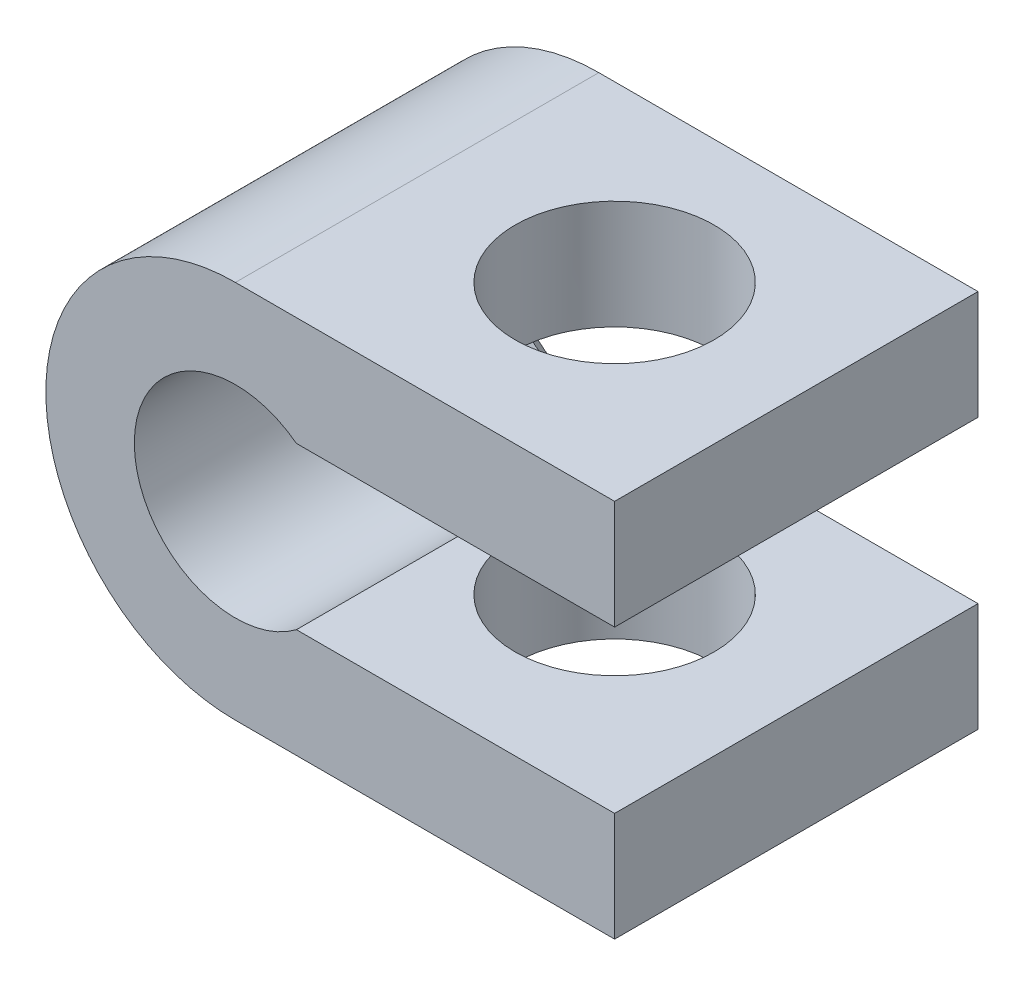
ISO-10303-21;
HEADER;
FILE_DESCRIPTION(('STEP AP214'),'2;1');
FILE_NAME('part.step','',(''),(''),'','','');
FILE_SCHEMA(('AUTOMOTIVE_DESIGN { 1 0 10303 214 1 1 1 1 }'));
ENDSEC;
DATA;
#1=APPLICATION_CONTEXT('core data for automotive mechanical design processes');
#2=APPLICATION_PROTOCOL_DEFINITION('international standard','automotive_design',2000,#1);
#3=PRODUCT_CONTEXT('',#1,'mechanical');
#4=PRODUCT('Part','Part','',(#3));
#5=PRODUCT_RELATED_PRODUCT_CATEGORY('part','',(#4));
#6=PRODUCT_DEFINITION_FORMATION('','',#4);
#7=PRODUCT_DEFINITION_CONTEXT('part definition',#1,'design');
#8=PRODUCT_DEFINITION('design','',#6,#7);
#9=PRODUCT_DEFINITION_SHAPE('','',#8);
#10=(LENGTH_UNIT() NAMED_UNIT(*) SI_UNIT(.MILLI.,.METRE.));
#11=(NAMED_UNIT(*) PLANE_ANGLE_UNIT() SI_UNIT($,.RADIAN.));
#12=(NAMED_UNIT(*) SI_UNIT($,.STERADIAN.) SOLID_ANGLE_UNIT());
#13=UNCERTAINTY_MEASURE_WITH_UNIT(LENGTH_MEASURE(1.E-05),#10,'distance_accuracy_value','');
#14=(GEOMETRIC_REPRESENTATION_CONTEXT(3) GLOBAL_UNCERTAINTY_ASSIGNED_CONTEXT((#13)) GLOBAL_UNIT_ASSIGNED_CONTEXT((#10,
#11,#12)) REPRESENTATION_CONTEXT('',''));
#15=CARTESIAN_POINT('',(0.,0.,0.));
#16=DIRECTION('',(0.,0.,1.));
#17=DIRECTION('',(1.,0.,0.));
#18=AXIS2_PLACEMENT_3D('',#15,#16,#17);
#19=CARTESIAN_POINT('',(0.,0.,12.));
#20=DIRECTION('',(0.,0.,-1.));
#21=DIRECTION('',(-1.,0.,0.));
#22=AXIS2_PLACEMENT_3D('',#19,#20,#21);
#23=CYLINDRICAL_SURFACE('',#22,3.2);
#24=DIRECTION('',(0.,0.,-1.));
#25=VECTOR('',#24,1.);
#26=CARTESIAN_POINT('',(1.92968099110157,-2.55271057360235,12.));
#27=LINE('',#26,#25);
#28=CARTESIAN_POINT('',(1.92968099110157,-2.55271057360235,12.));
#29=VERTEX_POINT('',#28);
#30=CARTESIAN_POINT('',(1.92968099110157,-2.55271057360235,0.5));
#31=VERTEX_POINT('',#30);
#32=EDGE_CURVE('E294',#29,#31,#27,.T.);
#33=ORIENTED_EDGE('',*,*,#32,.T.);
#34=CARTESIAN_POINT('',(0.,0.,0.5));
#35=DIRECTION('',(0.,0.,1.));
#36=DIRECTION('',(1.,0.,0.));
#37=AXIS2_PLACEMENT_3D('',#34,#35,#36);
#38=CIRCLE('',#37,3.2);
#39=CARTESIAN_POINT('',(1.92968099110157,2.55271057360235,0.5));
#40=VERTEX_POINT('',#39);
#41=EDGE_CURVE('E43',#31,#40,#38,.F.);
#42=ORIENTED_EDGE('',*,*,#41,.T.);
#43=DIRECTION('',(0.,0.,-1.));
#44=VECTOR('',#43,1.);
#45=CARTESIAN_POINT('',(1.92968099110157,2.55271057360235,12.));
#46=LINE('',#45,#44);
#47=CARTESIAN_POINT('',(1.92968099110157,2.55271057360235,12.));
#48=VERTEX_POINT('',#47);
#49=EDGE_CURVE('E128',#48,#40,#46,.T.);
#50=ORIENTED_EDGE('',*,*,#49,.F.);
#51=CARTESIAN_POINT('',(0.,0.,12.));
#52=DIRECTION('',(0.,0.,-1.));
#53=DIRECTION('',(1.,0.,0.));
#54=AXIS2_PLACEMENT_3D('',#51,#52,#53);
#55=CIRCLE('',#54,3.2);
#56=EDGE_CURVE('E135',#29,#48,#55,.T.);
#57=ORIENTED_EDGE('',*,*,#56,.F.);
#58=EDGE_LOOP('',(#33,#42,#50,#57));
#59=FACE_BOUND('',#58,.T.);
#60=ADVANCED_FACE('F34',(#59),#23,.F.);
#61=CARTESIAN_POINT('',(12.,2.55271057360235,12.));
#62=DIRECTION('',(0.,1.,0.));
#63=DIRECTION('',(-1.,0.,0.));
#64=AXIS2_PLACEMENT_3D('',#61,#62,#63);
#65=PLANE('',#64);
#66=CARTESIAN_POINT('',(6.,2.55271057360235,6.));
#67=DIRECTION('',(0.,1.,0.));
#68=DIRECTION('',(-1.,0.,0.));
#69=AXIS2_PLACEMENT_3D('',#66,#67,#68);
#70=CIRCLE('',#69,3.15);
#71=CARTESIAN_POINT('',(2.85,2.55271057360235,6.));
#72=VERTEX_POINT('',#71);
#73=EDGE_CURVE('E141',#72,#72,#70,.T.);
#74=ORIENTED_EDGE('',*,*,#73,.T.);
#75=EDGE_LOOP('',(#74));
#76=FACE_BOUND('',#75,.T.);
#77=ORIENTED_EDGE('',*,*,#49,.T.);
#78=DIRECTION('',(1.,0.,0.));
#79=VECTOR('',#78,1.);
#80=CARTESIAN_POINT('',(12.,2.55271057360235,0.5));
#81=LINE('',#80,#79);
#82=CARTESIAN_POINT('',(12.,2.55271057360235,0.5));
#83=VERTEX_POINT('',#82);
#84=EDGE_CURVE('E11',#40,#83,#81,.T.);
#85=ORIENTED_EDGE('',*,*,#84,.T.);
#86=DIRECTION('',(0.,0.,-1.));
#87=VECTOR('',#86,1.);
#88=CARTESIAN_POINT('',(12.,2.55271057360235,12.));
#89=LINE('',#88,#87);
#90=CARTESIAN_POINT('',(12.,2.55271057360235,12.));
#91=VERTEX_POINT('',#90);
#92=EDGE_CURVE('E131',#91,#83,#89,.T.);
#93=ORIENTED_EDGE('',*,*,#92,.F.);
#94=DIRECTION('',(1.,0.,0.));
#95=VECTOR('',#94,1.);
#96=CARTESIAN_POINT('',(12.,2.55271057360235,12.));
#97=LINE('',#96,#95);
#98=EDGE_CURVE('E125',#48,#91,#97,.T.);
#99=ORIENTED_EDGE('',*,*,#98,.F.);
#100=EDGE_LOOP('',(#77,#85,#93,#99));
#101=FACE_BOUND('',#100,.T.);
#102=ADVANCED_FACE('F127',(#76,#101),#65,.F.);
#103=CARTESIAN_POINT('',(12.,6.,12.));
#104=DIRECTION('',(-1.,0.,0.));
#105=DIRECTION('',(0.,0.,1.));
#106=AXIS2_PLACEMENT_3D('',#103,#104,#105);
#107=PLANE('',#106);
#108=ORIENTED_EDGE('',*,*,#92,.T.);
#109=DIRECTION('',(0.,1.,0.));
#110=VECTOR('',#109,1.);
#111=CARTESIAN_POINT('',(12.,6.,0.5));
#112=LINE('',#111,#110);
#113=CARTESIAN_POINT('',(12.,6.,0.5));
#114=VERTEX_POINT('',#113);
#115=EDGE_CURVE('E178',#83,#114,#112,.T.);
#116=ORIENTED_EDGE('',*,*,#115,.T.);
#117=DIRECTION('',(0.,0.,-1.));
#118=VECTOR('',#117,1.);
#119=CARTESIAN_POINT('',(12.,6.,12.));
#120=LINE('',#119,#118);
#121=CARTESIAN_POINT('',(12.,6.,12.));
#122=VERTEX_POINT('',#121);
#123=EDGE_CURVE('E148',#122,#114,#120,.T.);
#124=ORIENTED_EDGE('',*,*,#123,.F.);
#125=DIRECTION('',(0.,1.,0.));
#126=VECTOR('',#125,1.);
#127=CARTESIAN_POINT('',(12.,6.,12.));
#128=LINE('',#127,#126);
#129=EDGE_CURVE('E134',#91,#122,#128,.T.);
#130=ORIENTED_EDGE('',*,*,#129,.F.);
#131=EDGE_LOOP('',(#108,#116,#124,#130));
#132=FACE_BOUND('',#131,.T.);
#133=ADVANCED_FACE('F284',(#132),#107,.F.);
#134=CARTESIAN_POINT('',(0.,6.,12.));
#135=DIRECTION('',(0.,-1.,0.));
#136=DIRECTION('',(0.,0.,-1.));
#137=AXIS2_PLACEMENT_3D('',#134,#135,#136);
#138=PLANE('',#137);
#139=CARTESIAN_POINT('',(6.,6.,6.));
#140=DIRECTION('',(0.,1.,0.));
#141=DIRECTION('',(0.,0.,1.));
#142=AXIS2_PLACEMENT_3D('',#139,#140,#141);
#143=CIRCLE('',#142,3.15);
#144=CARTESIAN_POINT('',(6.,6.,9.15));
#145=VERTEX_POINT('',#144);
#146=EDGE_CURVE('E227',#145,#145,#143,.T.);
#147=ORIENTED_EDGE('',*,*,#146,.F.);
#148=EDGE_LOOP('',(#147));
#149=FACE_BOUND('',#148,.T.);
#150=ORIENTED_EDGE('',*,*,#123,.T.);
#151=DIRECTION('',(-1.,0.,0.));
#152=VECTOR('',#151,1.);
#153=CARTESIAN_POINT('',(0.,6.,0.5));
#154=LINE('',#153,#152);
#155=CARTESIAN_POINT('',(0.,6.,0.5));
#156=VERTEX_POINT('',#155);
#157=EDGE_CURVE('E176',#114,#156,#154,.T.);
#158=ORIENTED_EDGE('',*,*,#157,.T.);
#159=DIRECTION('',(0.,0.,-1.));
#160=VECTOR('',#159,1.);
#161=CARTESIAN_POINT('',(0.,6.,12.));
#162=LINE('',#161,#160);
#163=CARTESIAN_POINT('',(0.,6.,12.));
#164=VERTEX_POINT('',#163);
#165=EDGE_CURVE('E265',#164,#156,#162,.T.);
#166=ORIENTED_EDGE('',*,*,#165,.F.);
#167=DIRECTION('',(-1.,0.,0.));
#168=VECTOR('',#167,1.);
#169=CARTESIAN_POINT('',(0.,6.,12.));
#170=LINE('',#169,#168);
#171=EDGE_CURVE('E282',#122,#164,#170,.T.);
#172=ORIENTED_EDGE('',*,*,#171,.F.);
#173=EDGE_LOOP('',(#150,#158,#166,#172));
#174=FACE_BOUND('',#173,.T.);
#175=ADVANCED_FACE('F281',(#149,#174),#138,.F.);
#176=CARTESIAN_POINT('',(0.,0.,12.));
#177=DIRECTION('',(0.,0.,-1.));
#178=DIRECTION('',(-1.,0.,0.));
#179=AXIS2_PLACEMENT_3D('',#176,#177,#178);
#180=CYLINDRICAL_SURFACE('',#179,6.);
#181=ORIENTED_EDGE('',*,*,#165,.T.);
#182=CARTESIAN_POINT('',(0.,0.,0.5));
#183=DIRECTION('',(0.,0.,1.));
#184=DIRECTION('',(1.,0.,0.));
#185=AXIS2_PLACEMENT_3D('',#182,#183,#184);
#186=CIRCLE('',#185,6.);
#187=CARTESIAN_POINT('',(0.,-6.,0.5));
#188=VERTEX_POINT('',#187);
#189=EDGE_CURVE('E174',#156,#188,#186,.T.);
#190=ORIENTED_EDGE('',*,*,#189,.T.);
#191=DIRECTION('',(0.,0.,-1.));
#192=VECTOR('',#191,1.);
#193=CARTESIAN_POINT('',(0.,-6.,12.));
#194=LINE('',#193,#192);
#195=CARTESIAN_POINT('',(0.,-6.,12.));
#196=VERTEX_POINT('',#195);
#197=EDGE_CURVE('E262',#196,#188,#194,.T.);
#198=ORIENTED_EDGE('',*,*,#197,.F.);
#199=CARTESIAN_POINT('',(0.,0.,12.));
#200=DIRECTION('',(0.,0.,1.));
#201=DIRECTION('',(1.,0.,0.));
#202=AXIS2_PLACEMENT_3D('',#199,#200,#201);
#203=CIRCLE('',#202,6.);
#204=EDGE_CURVE('E286',#164,#196,#203,.T.);
#205=ORIENTED_EDGE('',*,*,#204,.F.);
#206=EDGE_LOOP('',(#181,#190,#198,#205));
#207=FACE_BOUND('',#206,.T.);
#208=ADVANCED_FACE('F260',(#207),#180,.T.);
#209=CARTESIAN_POINT('',(0.,-6.,12.));
#210=DIRECTION('',(0.,1.,0.));
#211=DIRECTION('',(0.,0.,1.));
#212=AXIS2_PLACEMENT_3D('',#209,#210,#211);
#213=PLANE('',#212);
#214=CARTESIAN_POINT('',(6.,-6.,6.));
#215=DIRECTION('',(0.,1.,0.));
#216=DIRECTION('',(0.,0.,1.));
#217=AXIS2_PLACEMENT_3D('',#214,#215,#216);
#218=CIRCLE('',#217,3.15);
#219=CARTESIAN_POINT('',(6.,-6.,9.15));
#220=VERTEX_POINT('',#219);
#221=EDGE_CURVE('E154',#220,#220,#218,.T.);
#222=ORIENTED_EDGE('',*,*,#221,.T.);
#223=EDGE_LOOP('',(#222));
#224=FACE_BOUND('',#223,.T.);
#225=ORIENTED_EDGE('',*,*,#197,.T.);
#226=DIRECTION('',(1.,0.,0.));
#227=VECTOR('',#226,1.);
#228=CARTESIAN_POINT('',(0.,-6.,0.5));
#229=LINE('',#228,#227);
#230=CARTESIAN_POINT('',(12.,-6.,0.5));
#231=VERTEX_POINT('',#230);
#232=EDGE_CURVE('E143',#188,#231,#229,.T.);
#233=ORIENTED_EDGE('',*,*,#232,.T.);
#234=DIRECTION('',(0.,0.,-1.));
#235=VECTOR('',#234,1.);
#236=CARTESIAN_POINT('',(12.,-6.,12.));
#237=LINE('',#236,#235);
#238=CARTESIAN_POINT('',(12.,-6.,12.));
#239=VERTEX_POINT('',#238);
#240=EDGE_CURVE('E271',#239,#231,#237,.T.);
#241=ORIENTED_EDGE('',*,*,#240,.F.);
#242=DIRECTION('',(1.,0.,0.));
#243=VECTOR('',#242,1.);
#244=CARTESIAN_POINT('',(0.,-6.,12.));
#245=LINE('',#244,#243);
#246=EDGE_CURVE('E270',#196,#239,#245,.T.);
#247=ORIENTED_EDGE('',*,*,#246,.F.);
#248=EDGE_LOOP('',(#225,#233,#241,#247));
#249=FACE_BOUND('',#248,.T.);
#250=ADVANCED_FACE('F267',(#224,#249),#213,.F.);
#251=CARTESIAN_POINT('',(12.,-6.,12.));
#252=DIRECTION('',(-1.,0.,0.));
#253=DIRECTION('',(0.,0.,1.));
#254=AXIS2_PLACEMENT_3D('',#251,#252,#253);
#255=PLANE('',#254);
#256=ORIENTED_EDGE('',*,*,#240,.T.);
#257=DIRECTION('',(0.,1.,0.));
#258=VECTOR('',#257,1.);
#259=CARTESIAN_POINT('',(12.,-6.,0.5));
#260=LINE('',#259,#258);
#261=CARTESIAN_POINT('',(12.,-2.55271057360235,0.5));
#262=VERTEX_POINT('',#261);
#263=EDGE_CURVE('E172',#231,#262,#260,.T.);
#264=ORIENTED_EDGE('',*,*,#263,.T.);
#265=DIRECTION('',(0.,0.,-1.));
#266=VECTOR('',#265,1.);
#267=CARTESIAN_POINT('',(12.,-2.55271057360235,12.));
#268=LINE('',#267,#266);
#269=CARTESIAN_POINT('',(12.,-2.55271057360235,12.));
#270=VERTEX_POINT('',#269);
#271=EDGE_CURVE('E274',#270,#262,#268,.T.);
#272=ORIENTED_EDGE('',*,*,#271,.F.);
#273=DIRECTION('',(0.,1.,0.));
#274=VECTOR('',#273,1.);
#275=CARTESIAN_POINT('',(12.,-6.,12.));
#276=LINE('',#275,#274);
#277=EDGE_CURVE('E291',#239,#270,#276,.T.);
#278=ORIENTED_EDGE('',*,*,#277,.F.);
#279=EDGE_LOOP('',(#256,#264,#272,#278));
#280=FACE_BOUND('',#279,.T.);
#281=ADVANCED_FACE('F299',(#280),#255,.F.);
#282=CARTESIAN_POINT('',(12.,-2.55271057360235,12.));
#283=DIRECTION('',(0.,-1.,0.));
#284=DIRECTION('',(1.,0.,0.));
#285=AXIS2_PLACEMENT_3D('',#282,#283,#284);
#286=PLANE('',#285);
#287=CARTESIAN_POINT('',(6.,-2.55271057360235,6.));
#288=DIRECTION('',(0.,-1.,0.));
#289=DIRECTION('',(1.,0.,0.));
#290=AXIS2_PLACEMENT_3D('',#287,#288,#289);
#291=CIRCLE('',#290,3.15);
#292=CARTESIAN_POINT('',(9.15,-2.55271057360235,6.));
#293=VERTEX_POINT('',#292);
#294=EDGE_CURVE('E152',#293,#293,#291,.T.);
#295=ORIENTED_EDGE('',*,*,#294,.T.);
#296=EDGE_LOOP('',(#295));
#297=FACE_BOUND('',#296,.T.);
#298=ORIENTED_EDGE('',*,*,#271,.T.);
#299=DIRECTION('',(-1.,0.,0.));
#300=VECTOR('',#299,1.);
#301=CARTESIAN_POINT('',(12.,-2.55271057360235,0.5));
#302=LINE('',#301,#300);
#303=EDGE_CURVE('E58',#262,#31,#302,.T.);
#304=ORIENTED_EDGE('',*,*,#303,.T.);
#305=ORIENTED_EDGE('',*,*,#32,.F.);
#306=DIRECTION('',(-1.,0.,0.));
#307=VECTOR('',#306,1.);
#308=CARTESIAN_POINT('',(12.,-2.55271057360235,12.));
#309=LINE('',#308,#307);
#310=EDGE_CURVE('E140',#270,#29,#309,.T.);
#311=ORIENTED_EDGE('',*,*,#310,.F.);
#312=EDGE_LOOP('',(#298,#304,#305,#311));
#313=FACE_BOUND('',#312,.T.);
#314=ADVANCED_FACE('F296',(#297,#313),#286,.F.);
#315=CARTESIAN_POINT('',(0.,0.,12.));
#316=DIRECTION('',(0.,0.,1.));
#317=DIRECTION('',(1.,0.,0.));
#318=AXIS2_PLACEMENT_3D('',#315,#316,#317);
#319=PLANE('',#318);
#320=ORIENTED_EDGE('',*,*,#56,.T.);
#321=ORIENTED_EDGE('',*,*,#98,.T.);
#322=ORIENTED_EDGE('',*,*,#129,.T.);
#323=ORIENTED_EDGE('',*,*,#171,.T.);
#324=ORIENTED_EDGE('',*,*,#204,.T.);
#325=ORIENTED_EDGE('',*,*,#246,.T.);
#326=ORIENTED_EDGE('',*,*,#277,.T.);
#327=ORIENTED_EDGE('',*,*,#310,.T.);
#328=EDGE_LOOP('',(#320,#321,#322,#323,#324,#325,#326,#327));
#329=FACE_BOUND('',#328,.T.);
#330=ADVANCED_FACE('F138',(#329),#319,.T.);
#331=CARTESIAN_POINT('',(0.,0.,0.));
#332=DIRECTION('',(0.,0.,1.));
#333=DIRECTION('',(1.,0.,0.));
#334=AXIS2_PLACEMENT_3D('',#331,#332,#333);
#335=PLANE('',#334);
#336=DIRECTION('',(0.,-1.,0.));
#337=VECTOR('',#336,1.);
#338=CARTESIAN_POINT('',(11.5,0.,0.));
#339=LINE('',#338,#337);
#340=CARTESIAN_POINT('',(11.5,-3.05271057360236,0.));
#341=VERTEX_POINT('',#340);
#342=CARTESIAN_POINT('',(11.5,-5.5,0.));
#343=VERTEX_POINT('',#342);
#344=EDGE_CURVE('E167',#341,#343,#339,.T.);
#345=ORIENTED_EDGE('',*,*,#344,.T.);
#346=DIRECTION('',(-1.,0.,0.));
#347=VECTOR('',#346,1.);
#348=CARTESIAN_POINT('',(0.,-5.5,0.));
#349=LINE('',#348,#347);
#350=CARTESIAN_POINT('',(0.,-5.5,0.));
#351=VERTEX_POINT('',#350);
#352=EDGE_CURVE('E169',#343,#351,#349,.T.);
#353=ORIENTED_EDGE('',*,*,#352,.T.);
#354=CARTESIAN_POINT('',(0.,0.,0.));
#355=DIRECTION('',(0.,0.,1.));
#356=DIRECTION('',(1.,0.,0.));
#357=AXIS2_PLACEMENT_3D('',#354,#355,#356);
#358=CIRCLE('',#357,5.5);
#359=CARTESIAN_POINT('',(0.,5.5,0.));
#360=VERTEX_POINT('',#359);
#361=EDGE_CURVE('E165',#351,#360,#358,.F.);
#362=ORIENTED_EDGE('',*,*,#361,.T.);
#363=DIRECTION('',(1.,0.,0.));
#364=VECTOR('',#363,1.);
#365=CARTESIAN_POINT('',(0.,5.5,0.));
#366=LINE('',#365,#364);
#367=CARTESIAN_POINT('',(11.5,5.5,0.));
#368=VERTEX_POINT('',#367);
#369=EDGE_CURVE('E163',#360,#368,#366,.T.);
#370=ORIENTED_EDGE('',*,*,#369,.T.);
#371=DIRECTION('',(0.,-1.,0.));
#372=VECTOR('',#371,1.);
#373=CARTESIAN_POINT('',(11.5,0.,0.));
#374=LINE('',#373,#372);
#375=CARTESIAN_POINT('',(11.5,3.05271057360236,0.));
#376=VERTEX_POINT('',#375);
#377=EDGE_CURVE('E161',#368,#376,#374,.T.);
#378=ORIENTED_EDGE('',*,*,#377,.T.);
#379=DIRECTION('',(-1.,0.,0.));
#380=VECTOR('',#379,1.);
#381=CARTESIAN_POINT('',(0.,3.05271057360236,0.));
#382=LINE('',#381,#380);
#383=CARTESIAN_POINT('',(2.09068365704053,3.05271057360236,0.));
#384=VERTEX_POINT('',#383);
#385=EDGE_CURVE('E146',#376,#384,#382,.T.);
#386=ORIENTED_EDGE('',*,*,#385,.T.);
#387=CARTESIAN_POINT('',(0.,0.,0.));
#388=DIRECTION('',(0.,0.,1.));
#389=DIRECTION('',(1.,0.,0.));
#390=AXIS2_PLACEMENT_3D('',#387,#388,#389);
#391=CIRCLE('',#390,3.7);
#392=CARTESIAN_POINT('',(2.09068365704053,-3.05271057360236,0.));
#393=VERTEX_POINT('',#392);
#394=EDGE_CURVE('E157',#384,#393,#391,.T.);
#395=ORIENTED_EDGE('',*,*,#394,.T.);
#396=DIRECTION('',(1.,0.,0.));
#397=VECTOR('',#396,1.);
#398=CARTESIAN_POINT('',(0.,-3.05271057360236,0.));
#399=LINE('',#398,#397);
#400=EDGE_CURVE('E159',#393,#341,#399,.T.);
#401=ORIENTED_EDGE('',*,*,#400,.T.);
#402=EDGE_LOOP('',(#345,#353,#362,#370,#378,#386,#395,#401));
#403=FACE_BOUND('',#402,.T.);
#404=ADVANCED_FACE('F239',(#403),#335,.F.);
#405=CARTESIAN_POINT('',(6.,-6.,6.));
#406=DIRECTION('',(0.,1.,0.));
#407=DIRECTION('',(0.,0.,1.));
#408=AXIS2_PLACEMENT_3D('',#405,#406,#407);
#409=CYLINDRICAL_SURFACE('',#408,3.15);
#410=ORIENTED_EDGE('',*,*,#221,.F.);
#411=EDGE_LOOP('',(#410));
#412=FACE_BOUND('',#411,.T.);
#413=ORIENTED_EDGE('',*,*,#294,.F.);
#414=EDGE_LOOP('',(#413));
#415=FACE_BOUND('',#414,.T.);
#416=ADVANCED_FACE('F376',(#412,#415),#409,.F.);
#417=ORIENTED_EDGE('',*,*,#146,.T.);
#418=EDGE_LOOP('',(#417));
#419=FACE_BOUND('',#418,.T.);
#420=ORIENTED_EDGE('',*,*,#73,.F.);
#421=EDGE_LOOP('',(#420));
#422=FACE_BOUND('',#421,.T.);
#423=ADVANCED_FACE('F216',(#419,#422),#409,.F.);
#424=CARTESIAN_POINT('',(12.,2.55271057360235,0.5));
#425=DIRECTION('',(0.,0.707106781186547,0.707106781186548));
#426=DIRECTION('',(1.,0.,0.));
#427=AXIS2_PLACEMENT_3D('',#424,#425,#426);
#428=PLANE('',#427);
#429=CARTESIAN_POINT('',(1.92968099110157,2.55271057360235,0.5));
#430=CARTESIAN_POINT('',(1.95753607745007,2.635879592847,0.416830980755352));
#431=CARTESIAN_POINT('',(1.98488052702274,2.71913082597165,0.33357974763071));
#432=CARTESIAN_POINT('',(2.03854807955508,2.885797493086,0.166913080516351));
#433=CARTESIAN_POINT('',(2.06487118529539,2.96921292662803,0.0834976469743262));
#434=CARTESIAN_POINT('',(2.09068365704053,3.05271057360236,0.));
#435=B_SPLINE_CURVE_WITH_KNOTS('',3,(#429,#430,#431,#432,#433,#434),.UNSPECIFIED.,.F.,.F.,(4,2,
4),(0.,0.362606247883038,0.725211508485271),.UNSPECIFIED.);
#436=EDGE_CURVE('E218',#384,#40,#435,.F.);
#437=ORIENTED_EDGE('',*,*,#436,.F.);
#438=ORIENTED_EDGE('',*,*,#385,.F.);
#439=DIRECTION('',(0.577350269189626,-0.577350269189626,0.577350269189626));
#440=VECTOR('',#439,1.);
#441=CARTESIAN_POINT('',(12.,2.55271057360235,0.5));
#442=LINE('',#441,#440);
#443=EDGE_CURVE('E38',#83,#376,#442,.F.);
#444=ORIENTED_EDGE('',*,*,#443,.F.);
#445=ORIENTED_EDGE('',*,*,#84,.F.);
#446=EDGE_LOOP('',(#437,#438,#444,#445));
#447=FACE_BOUND('',#446,.T.);
#448=ADVANCED_FACE('F213',(#447),#428,.F.);
#449=CARTESIAN_POINT('',(12.,6.,0.5));
#450=DIRECTION('',(-0.707106781186547,0.,0.707106781186547));
#451=DIRECTION('',(0.,1.,0.));
#452=AXIS2_PLACEMENT_3D('',#449,#450,#451);
#453=PLANE('',#452);
#454=ORIENTED_EDGE('',*,*,#443,.T.);
#455=ORIENTED_EDGE('',*,*,#377,.F.);
#456=DIRECTION('',(0.577350269189626,0.577350269189626,0.577350269189626));
#457=VECTOR('',#456,1.);
#458=CARTESIAN_POINT('',(12.,6.,0.5));
#459=LINE('',#458,#457);
#460=EDGE_CURVE('E200',#114,#368,#459,.F.);
#461=ORIENTED_EDGE('',*,*,#460,.F.);
#462=ORIENTED_EDGE('',*,*,#115,.F.);
#463=EDGE_LOOP('',(#454,#455,#461,#462));
#464=FACE_BOUND('',#463,.T.);
#465=ADVANCED_FACE('F36',(#464),#453,.F.);
#466=CARTESIAN_POINT('',(0.,0.,0.5));
#467=DIRECTION('',(0.,0.,-1.));
#468=DIRECTION('',(-1.,0.,0.));
#469=AXIS2_PLACEMENT_3D('',#466,#467,#468);
#470=CONICAL_SURFACE('',#469,3.2,0.785398163397448);
#471=ORIENTED_EDGE('',*,*,#436,.T.);
#472=ORIENTED_EDGE('',*,*,#41,.F.);
#473=CARTESIAN_POINT('',(1.92968099110157,-2.55271057360235,0.5));
#474=CARTESIAN_POINT('',(1.95753607745007,-2.635879592847,0.416830980755352));
#475=CARTESIAN_POINT('',(1.98488052702274,-2.71913082597165,0.33357974763071));
#476=CARTESIAN_POINT('',(2.03854807955508,-2.885797493086,0.166913080516351));
#477=CARTESIAN_POINT('',(2.06487118529539,-2.96921292662803,0.0834976469743262));
#478=CARTESIAN_POINT('',(2.09068365704053,-3.05271057360236,0.));
#479=B_SPLINE_CURVE_WITH_KNOTS('',3,(#473,#474,#475,#476,#477,#478),.UNSPECIFIED.,.F.,.F.,(4,2,
4),(0.,0.362606247883038,0.725211508485271),.UNSPECIFIED.);
#480=EDGE_CURVE('E192',#393,#31,#479,.F.);
#481=ORIENTED_EDGE('',*,*,#480,.F.);
#482=ORIENTED_EDGE('',*,*,#394,.F.);
#483=EDGE_LOOP('',(#471,#472,#481,#482));
#484=FACE_BOUND('',#483,.T.);
#485=ADVANCED_FACE('F201',(#484),#470,.F.);
#486=CARTESIAN_POINT('',(0.,6.,0.5));
#487=DIRECTION('',(0.,-0.707106781186547,0.707106781186547));
#488=DIRECTION('',(-1.,0.,0.));
#489=AXIS2_PLACEMENT_3D('',#486,#487,#488);
#490=PLANE('',#489);
#491=ORIENTED_EDGE('',*,*,#460,.T.);
#492=ORIENTED_EDGE('',*,*,#369,.F.);
#493=DIRECTION('',(0.,-0.707106781186547,-0.707106781186547));
#494=VECTOR('',#493,1.);
#495=CARTESIAN_POINT('',(0.,6.,0.5));
#496=LINE('',#495,#494);
#497=EDGE_CURVE('E189',#156,#360,#496,.T.);
#498=ORIENTED_EDGE('',*,*,#497,.F.);
#499=ORIENTED_EDGE('',*,*,#157,.F.);
#500=EDGE_LOOP('',(#491,#492,#498,#499));
#501=FACE_BOUND('',#500,.T.);
#502=ADVANCED_FACE('F209',(#501),#490,.F.);
#503=CARTESIAN_POINT('',(12.,-2.55271057360235,0.5));
#504=DIRECTION('',(0.,-0.707106781186547,0.707106781186548));
#505=DIRECTION('',(-1.,0.,0.));
#506=AXIS2_PLACEMENT_3D('',#503,#504,#505);
#507=PLANE('',#506);
#508=ORIENTED_EDGE('',*,*,#480,.T.);
#509=ORIENTED_EDGE('',*,*,#303,.F.);
#510=DIRECTION('',(-0.577350269189626,-0.577350269189626,-0.577350269189626));
#511=VECTOR('',#510,1.);
#512=CARTESIAN_POINT('',(12.,-2.55271057360235,0.5));
#513=LINE('',#512,#511);
#514=EDGE_CURVE('E186',#341,#262,#513,.F.);
#515=ORIENTED_EDGE('',*,*,#514,.F.);
#516=ORIENTED_EDGE('',*,*,#400,.F.);
#517=EDGE_LOOP('',(#508,#509,#515,#516));
#518=FACE_BOUND('',#517,.T.);
#519=ADVANCED_FACE('F204',(#518),#507,.F.);
#520=CARTESIAN_POINT('',(0.,0.,0.5));
#521=DIRECTION('',(0.,0.,1.));
#522=DIRECTION('',(1.,0.,0.));
#523=AXIS2_PLACEMENT_3D('',#520,#521,#522);
#524=CONICAL_SURFACE('',#523,6.,0.785398163397448);
#525=ORIENTED_EDGE('',*,*,#497,.T.);
#526=ORIENTED_EDGE('',*,*,#361,.F.);
#527=DIRECTION('',(0.,0.707106781186547,-0.707106781186547));
#528=VECTOR('',#527,1.);
#529=CARTESIAN_POINT('',(0.,-6.,0.5));
#530=LINE('',#529,#528);
#531=EDGE_CURVE('E184',#188,#351,#530,.T.);
#532=ORIENTED_EDGE('',*,*,#531,.F.);
#533=ORIENTED_EDGE('',*,*,#189,.F.);
#534=EDGE_LOOP('',(#525,#526,#532,#533));
#535=FACE_BOUND('',#534,.T.);
#536=ADVANCED_FACE('F208',(#535),#524,.T.);
#537=CARTESIAN_POINT('',(12.,-6.,0.5));
#538=DIRECTION('',(-0.707106781186547,0.,0.707106781186547));
#539=DIRECTION('',(0.,1.,0.));
#540=AXIS2_PLACEMENT_3D('',#537,#538,#539);
#541=PLANE('',#540);
#542=ORIENTED_EDGE('',*,*,#514,.T.);
#543=ORIENTED_EDGE('',*,*,#263,.F.);
#544=DIRECTION('',(-0.577350269189626,0.577350269189626,-0.577350269189626));
#545=VECTOR('',#544,1.);
#546=CARTESIAN_POINT('',(12.,-6.,0.5));
#547=LINE('',#546,#545);
#548=EDGE_CURVE('E182',#343,#231,#547,.F.);
#549=ORIENTED_EDGE('',*,*,#548,.F.);
#550=ORIENTED_EDGE('',*,*,#344,.F.);
#551=EDGE_LOOP('',(#542,#543,#549,#550));
#552=FACE_BOUND('',#551,.T.);
#553=ADVANCED_FACE('F248',(#552),#541,.F.);
#554=CARTESIAN_POINT('',(0.,-6.,0.5));
#555=DIRECTION('',(0.,0.707106781186547,0.707106781186547));
#556=DIRECTION('',(1.,0.,0.));
#557=AXIS2_PLACEMENT_3D('',#554,#555,#556);
#558=PLANE('',#557);
#559=ORIENTED_EDGE('',*,*,#531,.T.);
#560=ORIENTED_EDGE('',*,*,#352,.F.);
#561=ORIENTED_EDGE('',*,*,#548,.T.);
#562=ORIENTED_EDGE('',*,*,#232,.F.);
#563=EDGE_LOOP('',(#559,#560,#561,#562));
#564=FACE_BOUND('',#563,.T.);
#565=ADVANCED_FACE('F251',(#564),#558,.F.);
#566=CLOSED_SHELL('',(#60,#102,#133,#175,#208,#250,#281,#314,#330,#404,#416,#423,#448,#465,#485,
#502,#519,#536,#553,#565));
#567=MANIFOLD_SOLID_BREP('B2',#566);
#568=ADVANCED_BREP_SHAPE_REPRESENTATION('',(#18,#567),#14);
#569=SHAPE_DEFINITION_REPRESENTATION(#9,#568);
ENDSEC;
END-ISO-10303-21;
